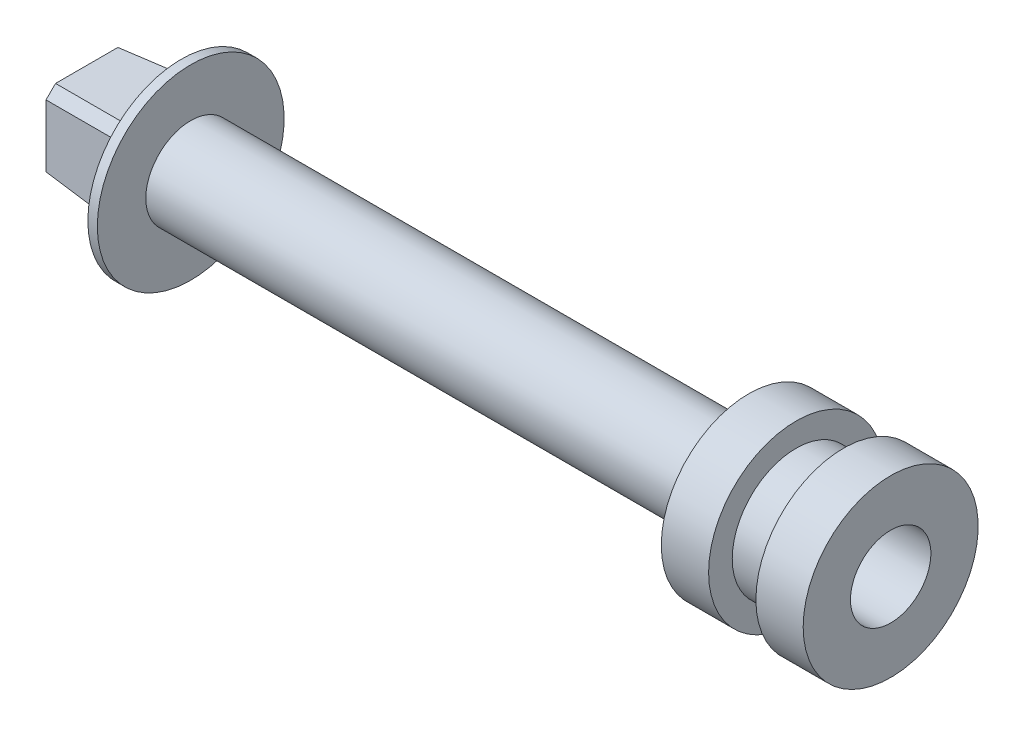
ISO-10303-21;
HEADER;
FILE_DESCRIPTION(('STEP AP214'),'2;1');
FILE_NAME('part.step','',(''),(''),'','','');
FILE_SCHEMA(('AUTOMOTIVE_DESIGN { 1 0 10303 214 1 1 1 1 }'));
ENDSEC;
DATA;
#1=APPLICATION_CONTEXT('core data for automotive mechanical design processes');
#2=APPLICATION_PROTOCOL_DEFINITION('international standard','automotive_design',2000,#1);
#3=PRODUCT_CONTEXT('',#1,'mechanical');
#4=PRODUCT('Part','Part','',(#3));
#5=PRODUCT_RELATED_PRODUCT_CATEGORY('part','',(#4));
#6=PRODUCT_DEFINITION_FORMATION('','',#4);
#7=PRODUCT_DEFINITION_CONTEXT('part definition',#1,'design');
#8=PRODUCT_DEFINITION('design','',#6,#7);
#9=PRODUCT_DEFINITION_SHAPE('','',#8);
#10=(LENGTH_UNIT() NAMED_UNIT(*) SI_UNIT(.MILLI.,.METRE.));
#11=(NAMED_UNIT(*) PLANE_ANGLE_UNIT() SI_UNIT($,.RADIAN.));
#12=(NAMED_UNIT(*) SI_UNIT($,.STERADIAN.) SOLID_ANGLE_UNIT());
#13=UNCERTAINTY_MEASURE_WITH_UNIT(LENGTH_MEASURE(1.E-05),#10,'distance_accuracy_value','');
#14=(GEOMETRIC_REPRESENTATION_CONTEXT(3) GLOBAL_UNCERTAINTY_ASSIGNED_CONTEXT((#13)) GLOBAL_UNIT_ASSIGNED_CONTEXT((#10,
#11,#12)) REPRESENTATION_CONTEXT('',''));
#15=CARTESIAN_POINT('',(0.,0.,0.));
#16=DIRECTION('',(0.,0.,1.));
#17=DIRECTION('',(1.,0.,0.));
#18=AXIS2_PLACEMENT_3D('',#15,#16,#17);
#19=CARTESIAN_POINT('',(0.,0.,0.));
#20=DIRECTION('',(1.,0.,0.));
#21=DIRECTION('',(0.,0.,-1.));
#22=AXIS2_PLACEMENT_3D('',#19,#20,#21);
#23=PLANE('',#22);
#24=CARTESIAN_POINT('',(0.,0.,0.));
#25=DIRECTION('',(-1.,0.,0.));
#26=DIRECTION('',(0.,0.,1.));
#27=AXIS2_PLACEMENT_3D('',#24,#25,#26);
#28=CIRCLE('',#27,39.5);
#29=CARTESIAN_POINT('',(0.,0.,39.5));
#30=VERTEX_POINT('',#29);
#31=EDGE_CURVE('E181',#30,#30,#28,.T.);
#32=ORIENTED_EDGE('',*,*,#31,.T.);
#33=EDGE_LOOP('',(#32));
#34=FACE_BOUND('',#33,.T.);
#35=DIRECTION('',(0.,-1.,0.));
#36=VECTOR('',#35,1.);
#37=CARTESIAN_POINT('',(0.,20.,-20.));
#38=LINE('',#37,#36);
#39=CARTESIAN_POINT('',(0.,15.9706253771279,-20.));
#40=VERTEX_POINT('',#39);
#41=CARTESIAN_POINT('',(0.,-15.9902798788361,-20.));
#42=VERTEX_POINT('',#41);
#43=EDGE_CURVE('E130',#40,#42,#38,.T.);
#44=ORIENTED_EDGE('',*,*,#43,.F.);
#45=DIRECTION('',(0.,-0.708833443361784,-0.705375892394882));
#46=VECTOR('',#45,1.);
#47=CARTESIAN_POINT('',(0.,17.9461473516864,-18.0341142354387));
#48=LINE('',#47,#46);
#49=CARTESIAN_POINT('',(0.,20.,-15.990279878836));
#50=VERTEX_POINT('',#49);
#51=EDGE_CURVE('E50',#40,#50,#48,.F.);
#52=ORIENTED_EDGE('',*,*,#51,.T.);
#53=DIRECTION('',(0.,0.,-1.));
#54=VECTOR('',#53,1.);
#55=CARTESIAN_POINT('',(0.,20.,-20.));
#56=LINE('',#55,#54);
#57=CARTESIAN_POINT('',(0.,20.,15.9706253771279));
#58=VERTEX_POINT('',#57);
#59=EDGE_CURVE('E133',#58,#50,#56,.T.);
#60=ORIENTED_EDGE('',*,*,#59,.F.);
#61=DIRECTION('',(0.,0.705375892394887,-0.708833443361779));
#62=VECTOR('',#61,1.);
#63=CARTESIAN_POINT('',(0.,18.0341142354385,17.9461473516865));
#64=LINE('',#63,#62);
#65=CARTESIAN_POINT('',(0.,15.9902798788359,20.));
#66=VERTEX_POINT('',#65);
#67=EDGE_CURVE('E11',#58,#66,#64,.F.);
#68=ORIENTED_EDGE('',*,*,#67,.T.);
#69=DIRECTION('',(0.,1.,0.));
#70=VECTOR('',#69,1.);
#71=CARTESIAN_POINT('',(0.,20.,20.));
#72=LINE('',#71,#70);
#73=CARTESIAN_POINT('',(0.,-15.9706253771279,20.));
#74=VERTEX_POINT('',#73);
#75=EDGE_CURVE('E129',#74,#66,#72,.T.);
#76=ORIENTED_EDGE('',*,*,#75,.F.);
#77=DIRECTION('',(0.,0.708833443361779,0.705375892394887));
#78=VECTOR('',#77,1.);
#79=CARTESIAN_POINT('',(0.,-17.9461473516865,18.0341142354386));
#80=LINE('',#79,#78);
#81=CARTESIAN_POINT('',(0.,-20.,15.990279878836));
#82=VERTEX_POINT('',#81);
#83=EDGE_CURVE('E114',#74,#82,#80,.F.);
#84=ORIENTED_EDGE('',*,*,#83,.T.);
#85=DIRECTION('',(0.,0.,1.));
#86=VECTOR('',#85,1.);
#87=CARTESIAN_POINT('',(0.,-20.,-20.));
#88=LINE('',#87,#86);
#89=CARTESIAN_POINT('',(0.,-20.,-15.970625377128));
#90=VERTEX_POINT('',#89);
#91=EDGE_CURVE('E121',#90,#82,#88,.T.);
#92=ORIENTED_EDGE('',*,*,#91,.F.);
#93=DIRECTION('',(0.,-0.705375892394882,0.708833443361784));
#94=VECTOR('',#93,1.);
#95=CARTESIAN_POINT('',(0.,-18.0341142354388,-17.9461473516864));
#96=LINE('',#95,#94);
#97=EDGE_CURVE('E106',#90,#42,#96,.F.);
#98=ORIENTED_EDGE('',*,*,#97,.T.);
#99=EDGE_LOOP('',(#44,#52,#60,#68,#76,#84,#92,#98));
#100=FACE_BOUND('',#99,.T.);
#101=ADVANCED_FACE('F41',(#34,#100),#23,.F.);
#102=CARTESIAN_POINT('',(0.,0.,0.));
#103=DIRECTION('',(-1.,0.,0.));
#104=DIRECTION('',(0.,0.,1.));
#105=AXIS2_PLACEMENT_3D('',#102,#103,#104);
#106=CYLINDRICAL_SURFACE('',#105,39.5);
#107=ORIENTED_EDGE('',*,*,#31,.F.);
#108=EDGE_LOOP('',(#107));
#109=FACE_BOUND('',#108,.T.);
#110=CARTESIAN_POINT('',(4.,0.,0.));
#111=DIRECTION('',(-1.,0.,0.));
#112=DIRECTION('',(0.,0.,1.));
#113=AXIS2_PLACEMENT_3D('',#110,#111,#112);
#114=CIRCLE('',#113,39.5);
#115=CARTESIAN_POINT('',(4.,0.,39.5));
#116=VERTEX_POINT('',#115);
#117=EDGE_CURVE('E178',#116,#116,#114,.T.);
#118=ORIENTED_EDGE('',*,*,#117,.T.);
#119=EDGE_LOOP('',(#118));
#120=FACE_BOUND('',#119,.T.);
#121=ADVANCED_FACE('F230',(#109,#120),#106,.T.);
#122=CARTESIAN_POINT('',(4.,39.5,0.));
#123=DIRECTION('',(-1.,0.,0.));
#124=DIRECTION('',(0.,0.,1.));
#125=AXIS2_PLACEMENT_3D('',#122,#123,#124);
#126=PLANE('',#125);
#127=ORIENTED_EDGE('',*,*,#117,.F.);
#128=EDGE_LOOP('',(#127));
#129=FACE_BOUND('',#128,.T.);
#130=CARTESIAN_POINT('',(4.,0.,0.));
#131=DIRECTION('',(-1.,0.,0.));
#132=DIRECTION('',(0.,0.,1.));
#133=AXIS2_PLACEMENT_3D('',#130,#131,#132);
#134=CIRCLE('',#133,19.);
#135=CARTESIAN_POINT('',(4.,0.,19.));
#136=VERTEX_POINT('',#135);
#137=EDGE_CURVE('E175',#136,#136,#134,.T.);
#138=ORIENTED_EDGE('',*,*,#137,.T.);
#139=EDGE_LOOP('',(#138));
#140=FACE_BOUND('',#139,.T.);
#141=ADVANCED_FACE('F236',(#129,#140),#126,.F.);
#142=CARTESIAN_POINT('',(0.,0.,0.));
#143=DIRECTION('',(-1.,0.,0.));
#144=DIRECTION('',(0.,0.,1.));
#145=AXIS2_PLACEMENT_3D('',#142,#143,#144);
#146=CYLINDRICAL_SURFACE('',#145,19.);
#147=ORIENTED_EDGE('',*,*,#137,.F.);
#148=EDGE_LOOP('',(#147));
#149=FACE_BOUND('',#148,.T.);
#150=CARTESIAN_POINT('',(240.,0.,0.));
#151=DIRECTION('',(-1.,0.,0.));
#152=DIRECTION('',(0.,0.,1.));
#153=AXIS2_PLACEMENT_3D('',#150,#151,#152);
#154=CIRCLE('',#153,19.);
#155=CARTESIAN_POINT('',(240.,0.,19.));
#156=VERTEX_POINT('',#155);
#157=EDGE_CURVE('E172',#156,#156,#154,.T.);
#158=ORIENTED_EDGE('',*,*,#157,.T.);
#159=EDGE_LOOP('',(#158));
#160=FACE_BOUND('',#159,.T.);
#161=ADVANCED_FACE('F416',(#149,#160),#146,.T.);
#162=CARTESIAN_POINT('',(240.,19.,0.));
#163=DIRECTION('',(1.,0.,0.));
#164=DIRECTION('',(0.,0.,-1.));
#165=AXIS2_PLACEMENT_3D('',#162,#163,#164);
#166=PLANE('',#165);
#167=ORIENTED_EDGE('',*,*,#157,.F.);
#168=EDGE_LOOP('',(#167));
#169=FACE_BOUND('',#168,.T.);
#170=CARTESIAN_POINT('',(240.,0.,0.));
#171=DIRECTION('',(-1.,0.,0.));
#172=DIRECTION('',(0.,0.,1.));
#173=AXIS2_PLACEMENT_3D('',#170,#171,#172);
#174=CIRCLE('',#173,37.);
#175=CARTESIAN_POINT('',(240.,0.,37.));
#176=VERTEX_POINT('',#175);
#177=EDGE_CURVE('E169',#176,#176,#174,.T.);
#178=ORIENTED_EDGE('',*,*,#177,.T.);
#179=EDGE_LOOP('',(#178));
#180=FACE_BOUND('',#179,.T.);
#181=ADVANCED_FACE('F406',(#169,#180),#166,.F.);
#182=CARTESIAN_POINT('',(0.,0.,0.));
#183=DIRECTION('',(-1.,0.,0.));
#184=DIRECTION('',(0.,0.,1.));
#185=AXIS2_PLACEMENT_3D('',#182,#183,#184);
#186=CYLINDRICAL_SURFACE('',#185,37.);
#187=ORIENTED_EDGE('',*,*,#177,.F.);
#188=EDGE_LOOP('',(#187));
#189=FACE_BOUND('',#188,.T.);
#190=CARTESIAN_POINT('',(260.,0.,0.));
#191=DIRECTION('',(-1.,0.,0.));
#192=DIRECTION('',(0.,0.,1.));
#193=AXIS2_PLACEMENT_3D('',#190,#191,#192);
#194=CIRCLE('',#193,37.);
#195=CARTESIAN_POINT('',(260.,0.,37.));
#196=VERTEX_POINT('',#195);
#197=EDGE_CURVE('E166',#196,#196,#194,.T.);
#198=ORIENTED_EDGE('',*,*,#197,.T.);
#199=EDGE_LOOP('',(#198));
#200=FACE_BOUND('',#199,.T.);
#201=ADVANCED_FACE('F396',(#189,#200),#186,.T.);
#202=CARTESIAN_POINT('',(260.,37.,0.));
#203=DIRECTION('',(-1.,0.,0.));
#204=DIRECTION('',(0.,0.,1.));
#205=AXIS2_PLACEMENT_3D('',#202,#203,#204);
#206=PLANE('',#205);
#207=ORIENTED_EDGE('',*,*,#197,.F.);
#208=EDGE_LOOP('',(#207));
#209=FACE_BOUND('',#208,.T.);
#210=CARTESIAN_POINT('',(260.,0.,0.));
#211=DIRECTION('',(-1.,0.,0.));
#212=DIRECTION('',(0.,0.,1.));
#213=AXIS2_PLACEMENT_3D('',#210,#211,#212);
#214=CIRCLE('',#213,27.);
#215=CARTESIAN_POINT('',(260.,0.,27.));
#216=VERTEX_POINT('',#215);
#217=EDGE_CURVE('E163',#216,#216,#214,.T.);
#218=ORIENTED_EDGE('',*,*,#217,.T.);
#219=EDGE_LOOP('',(#218));
#220=FACE_BOUND('',#219,.T.);
#221=ADVANCED_FACE('F386',(#209,#220),#206,.F.);
#222=CARTESIAN_POINT('',(0.,0.,0.));
#223=DIRECTION('',(-1.,0.,0.));
#224=DIRECTION('',(0.,0.,1.));
#225=AXIS2_PLACEMENT_3D('',#222,#223,#224);
#226=CYLINDRICAL_SURFACE('',#225,27.);
#227=ORIENTED_EDGE('',*,*,#217,.F.);
#228=EDGE_LOOP('',(#227));
#229=FACE_BOUND('',#228,.T.);
#230=CARTESIAN_POINT('',(280.,0.,0.));
#231=DIRECTION('',(-1.,0.,0.));
#232=DIRECTION('',(0.,0.,1.));
#233=AXIS2_PLACEMENT_3D('',#230,#231,#232);
#234=CIRCLE('',#233,27.);
#235=CARTESIAN_POINT('',(280.,0.,27.));
#236=VERTEX_POINT('',#235);
#237=EDGE_CURVE('E160',#236,#236,#234,.T.);
#238=ORIENTED_EDGE('',*,*,#237,.T.);
#239=EDGE_LOOP('',(#238));
#240=FACE_BOUND('',#239,.T.);
#241=ADVANCED_FACE('F376',(#229,#240),#226,.T.);
#242=CARTESIAN_POINT('',(280.,27.,0.));
#243=DIRECTION('',(1.,0.,0.));
#244=DIRECTION('',(0.,0.,-1.));
#245=AXIS2_PLACEMENT_3D('',#242,#243,#244);
#246=PLANE('',#245);
#247=ORIENTED_EDGE('',*,*,#237,.F.);
#248=EDGE_LOOP('',(#247));
#249=FACE_BOUND('',#248,.T.);
#250=CARTESIAN_POINT('',(280.,0.,0.));
#251=DIRECTION('',(-1.,0.,0.));
#252=DIRECTION('',(0.,0.,1.));
#253=AXIS2_PLACEMENT_3D('',#250,#251,#252);
#254=CIRCLE('',#253,37.);
#255=CARTESIAN_POINT('',(280.,0.,37.));
#256=VERTEX_POINT('',#255);
#257=EDGE_CURVE('E157',#256,#256,#254,.T.);
#258=ORIENTED_EDGE('',*,*,#257,.T.);
#259=EDGE_LOOP('',(#258));
#260=FACE_BOUND('',#259,.T.);
#261=ADVANCED_FACE('F366',(#249,#260),#246,.F.);
#262=CARTESIAN_POINT('',(0.,0.,0.));
#263=DIRECTION('',(-1.,0.,0.));
#264=DIRECTION('',(0.,0.,1.));
#265=AXIS2_PLACEMENT_3D('',#262,#263,#264);
#266=CYLINDRICAL_SURFACE('',#265,37.);
#267=ORIENTED_EDGE('',*,*,#257,.F.);
#268=EDGE_LOOP('',(#267));
#269=FACE_BOUND('',#268,.T.);
#270=CARTESIAN_POINT('',(300.,0.,0.));
#271=DIRECTION('',(-1.,0.,0.));
#272=DIRECTION('',(0.,0.,1.));
#273=AXIS2_PLACEMENT_3D('',#270,#271,#272);
#274=CIRCLE('',#273,37.);
#275=CARTESIAN_POINT('',(300.,0.,37.));
#276=VERTEX_POINT('',#275);
#277=EDGE_CURVE('E154',#276,#276,#274,.T.);
#278=ORIENTED_EDGE('',*,*,#277,.T.);
#279=EDGE_LOOP('',(#278));
#280=FACE_BOUND('',#279,.T.);
#281=ADVANCED_FACE('F356',(#269,#280),#266,.T.);
#282=CARTESIAN_POINT('',(300.,37.,0.));
#283=DIRECTION('',(-1.,0.,0.));
#284=DIRECTION('',(0.,0.,1.));
#285=AXIS2_PLACEMENT_3D('',#282,#283,#284);
#286=PLANE('',#285);
#287=ORIENTED_EDGE('',*,*,#277,.F.);
#288=EDGE_LOOP('',(#287));
#289=FACE_BOUND('',#288,.T.);
#290=CARTESIAN_POINT('',(300.,0.,0.));
#291=DIRECTION('',(-1.,0.,0.));
#292=DIRECTION('',(0.,0.,1.));
#293=AXIS2_PLACEMENT_3D('',#290,#291,#292);
#294=CIRCLE('',#293,17.);
#295=CARTESIAN_POINT('',(300.,0.,17.));
#296=VERTEX_POINT('',#295);
#297=EDGE_CURVE('E151',#296,#296,#294,.T.);
#298=ORIENTED_EDGE('',*,*,#297,.T.);
#299=EDGE_LOOP('',(#298));
#300=FACE_BOUND('',#299,.T.);
#301=ADVANCED_FACE('F346',(#289,#300),#286,.F.);
#302=CARTESIAN_POINT('',(0.,0.,0.));
#303=DIRECTION('',(-1.,0.,0.));
#304=DIRECTION('',(0.,0.,1.));
#305=AXIS2_PLACEMENT_3D('',#302,#303,#304);
#306=CYLINDRICAL_SURFACE('',#305,17.);
#307=ORIENTED_EDGE('',*,*,#297,.F.);
#308=EDGE_LOOP('',(#307));
#309=FACE_BOUND('',#308,.T.);
#310=CARTESIAN_POINT('',(270.,0.,0.));
#311=DIRECTION('',(-1.,0.,0.));
#312=DIRECTION('',(0.,0.,1.));
#313=AXIS2_PLACEMENT_3D('',#310,#311,#312);
#314=CIRCLE('',#313,17.0000000000001);
#315=CARTESIAN_POINT('',(270.,0.,17.0000000000001));
#316=VERTEX_POINT('',#315);
#317=EDGE_CURVE('E148',#316,#316,#314,.T.);
#318=ORIENTED_EDGE('',*,*,#317,.T.);
#319=EDGE_LOOP('',(#318));
#320=FACE_BOUND('',#319,.T.);
#321=ADVANCED_FACE('F337',(#309,#320),#306,.F.);
#322=CARTESIAN_POINT('',(270.,17.0000000000001,0.));
#323=DIRECTION('',(-1.,0.,0.));
#324=DIRECTION('',(0.,0.,1.));
#325=AXIS2_PLACEMENT_3D('',#322,#323,#324);
#326=PLANE('',#325);
#327=ORIENTED_EDGE('',*,*,#317,.F.);
#328=EDGE_LOOP('',(#327));
#329=FACE_BOUND('',#328,.T.);
#330=ADVANCED_FACE('F321',(#329),#326,.F.);
#331=CARTESIAN_POINT('',(0.,20.,-20.));
#332=DIRECTION('',(-0.0697564737441253,0.,-0.997564050259824));
#333=DIRECTION('',(-0.997564050259824,0.,0.0697564737441253));
#334=AXIS2_PLACEMENT_3D('',#331,#332,#333);
#335=PLANE('',#334);
#336=ORIENTED_EDGE('',*,*,#43,.T.);
#337=DIRECTION('',(0.995145815783509,-0.0695873743166647,-0.0695873743166647));
#338=VECTOR('',#337,1.);
#339=CARTESIAN_POINT('',(-2.49231192342248,-15.8160004516624,-19.8257205728263));
#340=LINE('',#339,#338);
#341=CARTESIAN_POINT('',(-40.,-13.1932074010957,-17.2029275222596));
#342=VERTEX_POINT('',#341);
#343=EDGE_CURVE('E111',#42,#342,#340,.F.);
#344=ORIENTED_EDGE('',*,*,#343,.T.);
#345=DIRECTION('',(0.,1.,0.));
#346=VECTOR('',#345,1.);
#347=CARTESIAN_POINT('',(-40.,20.,-17.2029275222596));
#348=LINE('',#347,#346);
#349=CARTESIAN_POINT('',(-40.,13.1735528993875,-17.2029275222596));
#350=VERTEX_POINT('',#349);
#351=EDGE_CURVE('E138',#350,#342,#348,.F.);
#352=ORIENTED_EDGE('',*,*,#351,.F.);
#353=DIRECTION('',(-0.995145815783509,-0.0695873743166647,0.0695873743166647));
#354=VECTOR('',#353,1.);
#355=CARTESIAN_POINT('',(0.279032517955649,15.9901372315371,-20.0195118544092));
#356=LINE('',#355,#354);
#357=EDGE_CURVE('E125',#350,#40,#356,.F.);
#358=ORIENTED_EDGE('',*,*,#357,.T.);
#359=EDGE_LOOP('',(#336,#344,#352,#358));
#360=FACE_BOUND('',#359,.T.);
#361=ADVANCED_FACE('F217',(#360),#335,.T.);
#362=CARTESIAN_POINT('',(0.,-20.,-20.));
#363=DIRECTION('',(-0.0697564737441253,-0.997564050259824,0.));
#364=DIRECTION('',(0.997564050259824,-0.0697564737441253,0.));
#365=AXIS2_PLACEMENT_3D('',#362,#363,#364);
#366=PLANE('',#365);
#367=DIRECTION('',(0.,0.,-1.));
#368=VECTOR('',#367,1.);
#369=CARTESIAN_POINT('',(-40.,-17.2029275222596,-20.));
#370=LINE('',#369,#368);
#371=CARTESIAN_POINT('',(-40.,-17.2029275222596,-13.1735528993876));
#372=VERTEX_POINT('',#371);
#373=CARTESIAN_POINT('',(-40.,-17.2029275222596,13.1932074010956));
#374=VERTEX_POINT('',#373);
#375=EDGE_CURVE('E124',#372,#374,#370,.F.);
#376=ORIENTED_EDGE('',*,*,#375,.F.);
#377=DIRECTION('',(-0.995145815783509,0.0695873743166647,0.0695873743166647));
#378=VECTOR('',#377,1.);
#379=CARTESIAN_POINT('',(0.279032517955641,-20.0195118544092,-15.9901372315372));
#380=LINE('',#379,#378);
#381=EDGE_CURVE('E110',#372,#90,#380,.F.);
#382=ORIENTED_EDGE('',*,*,#381,.T.);
#383=ORIENTED_EDGE('',*,*,#91,.T.);
#384=DIRECTION('',(0.995145815783509,-0.0695873743166647,0.0695873743166647));
#385=VECTOR('',#384,1.);
#386=CARTESIAN_POINT('',(-2.49231192342247,-19.8257205728263,15.8160004516623));
#387=LINE('',#386,#385);
#388=EDGE_CURVE('E126',#82,#374,#387,.F.);
#389=ORIENTED_EDGE('',*,*,#388,.T.);
#390=EDGE_LOOP('',(#376,#382,#383,#389));
#391=FACE_BOUND('',#390,.T.);
#392=ADVANCED_FACE('F120',(#391),#366,.T.);
#393=CARTESIAN_POINT('',(0.,20.,20.));
#394=DIRECTION('',(-0.0697564737441253,0.,0.997564050259824));
#395=DIRECTION('',(0.997564050259824,0.,0.0697564737441253));
#396=AXIS2_PLACEMENT_3D('',#393,#394,#395);
#397=PLANE('',#396);
#398=DIRECTION('',(0.,-1.,0.));
#399=VECTOR('',#398,1.);
#400=CARTESIAN_POINT('',(-40.,20.,17.2029275222596));
#401=LINE('',#400,#399);
#402=CARTESIAN_POINT('',(-40.,-13.1735528993875,17.2029275222596));
#403=VERTEX_POINT('',#402);
#404=CARTESIAN_POINT('',(-40.,13.1932074010955,17.2029275222596));
#405=VERTEX_POINT('',#404);
#406=EDGE_CURVE('E142',#403,#405,#401,.F.);
#407=ORIENTED_EDGE('',*,*,#406,.F.);
#408=DIRECTION('',(-0.995145815783509,0.0695873743166647,-0.0695873743166647));
#409=VECTOR('',#408,1.);
#410=CARTESIAN_POINT('',(-2.49095085734794,-15.7964411249656,19.8258157478377));
#411=LINE('',#410,#409);
#412=EDGE_CURVE('E198',#403,#74,#411,.F.);
#413=ORIENTED_EDGE('',*,*,#412,.T.);
#414=ORIENTED_EDGE('',*,*,#75,.T.);
#415=DIRECTION('',(0.995145815783509,0.0695873743166647,0.0695873743166647));
#416=VECTOR('',#415,1.);
#417=CARTESIAN_POINT('',(0.277671451881119,16.0096965582337,20.0194166793978));
#418=LINE('',#417,#416);
#419=EDGE_CURVE('E196',#66,#405,#418,.F.);
#420=ORIENTED_EDGE('',*,*,#419,.T.);
#421=EDGE_LOOP('',(#407,#413,#414,#420));
#422=FACE_BOUND('',#421,.T.);
#423=ADVANCED_FACE('F224',(#422),#397,.T.);
#424=CARTESIAN_POINT('',(0.,20.,-20.));
#425=DIRECTION('',(-0.0697564737441253,0.997564050259824,0.));
#426=DIRECTION('',(-0.997564050259824,-0.0697564737441253,0.));
#427=AXIS2_PLACEMENT_3D('',#424,#425,#426);
#428=PLANE('',#427);
#429=ORIENTED_EDGE('',*,*,#59,.T.);
#430=DIRECTION('',(0.995145815783509,0.0695873743166647,-0.0695873743166647));
#431=VECTOR('',#430,1.);
#432=CARTESIAN_POINT('',(0.277671451881115,20.0194166793978,-16.0096965582338));
#433=LINE('',#432,#431);
#434=CARTESIAN_POINT('',(-40.,17.2029275222596,-13.1932074010956));
#435=VERTEX_POINT('',#434);
#436=EDGE_CURVE('E115',#50,#435,#433,.F.);
#437=ORIENTED_EDGE('',*,*,#436,.T.);
#438=DIRECTION('',(0.,0.,1.));
#439=VECTOR('',#438,1.);
#440=CARTESIAN_POINT('',(-40.,17.2029275222596,-20.));
#441=LINE('',#440,#439);
#442=CARTESIAN_POINT('',(-40.,17.2029275222596,13.1735528993875));
#443=VERTEX_POINT('',#442);
#444=EDGE_CURVE('E145',#443,#435,#441,.F.);
#445=ORIENTED_EDGE('',*,*,#444,.F.);
#446=DIRECTION('',(-0.995145815783509,-0.0695873743166647,-0.0695873743166647));
#447=VECTOR('',#446,1.);
#448=CARTESIAN_POINT('',(-2.49095085734794,19.8258157478377,15.7964411249656));
#449=LINE('',#448,#447);
#450=EDGE_CURVE('E201',#443,#58,#449,.F.);
#451=ORIENTED_EDGE('',*,*,#450,.T.);
#452=EDGE_LOOP('',(#429,#437,#445,#451));
#453=FACE_BOUND('',#452,.T.);
#454=ADVANCED_FACE('F207',(#453),#428,.T.);
#455=CARTESIAN_POINT('',(-40.,0.,0.));
#456=DIRECTION('',(-1.,0.,0.));
#457=DIRECTION('',(0.,-1.,0.));
#458=AXIS2_PLACEMENT_3D('',#455,#456,#457);
#459=PLANE('',#458);
#460=ORIENTED_EDGE('',*,*,#351,.T.);
#461=DIRECTION('',(0.,0.705375892394882,-0.708833443361784));
#462=VECTOR('',#461,1.);
#463=CARTESIAN_POINT('',(-40.,-15.230220052877,-15.1559300168141));
#464=LINE('',#463,#462);
#465=EDGE_CURVE('E194',#342,#372,#464,.F.);
#466=ORIENTED_EDGE('',*,*,#465,.T.);
#467=ORIENTED_EDGE('',*,*,#375,.T.);
#468=DIRECTION('',(0.,-0.708833443361779,-0.705375892394887));
#469=VECTOR('',#468,1.);
#470=CARTESIAN_POINT('',(-40.,-15.1559300168142,15.2302200528769));
#471=LINE('',#470,#469);
#472=EDGE_CURVE('E192',#374,#403,#471,.F.);
#473=ORIENTED_EDGE('',*,*,#472,.T.);
#474=ORIENTED_EDGE('',*,*,#406,.T.);
#475=DIRECTION('',(0.,-0.705375892394887,0.708833443361779));
#476=VECTOR('',#475,1.);
#477=CARTESIAN_POINT('',(-40.,15.2302200528769,15.1559300168142));
#478=LINE('',#477,#476);
#479=EDGE_CURVE('E188',#405,#443,#478,.F.);
#480=ORIENTED_EDGE('',*,*,#479,.T.);
#481=ORIENTED_EDGE('',*,*,#444,.T.);
#482=DIRECTION('',(0.,0.708833443361784,0.705375892394882));
#483=VECTOR('',#482,1.);
#484=CARTESIAN_POINT('',(-40.,15.1559300168141,-15.230220052877));
#485=LINE('',#484,#483);
#486=EDGE_CURVE('E190',#435,#350,#485,.F.);
#487=ORIENTED_EDGE('',*,*,#486,.T.);
#488=EDGE_LOOP('',(#460,#466,#467,#473,#474,#480,#481,#487));
#489=FACE_BOUND('',#488,.T.);
#490=ADVANCED_FACE('F211',(#489),#459,.T.);
#491=CARTESIAN_POINT('',(0.279032517955641,-20.0195118544092,-15.9901372315372));
#492=DIRECTION('',(0.0984111172578949,0.70539265566623,0.701951888189067));
#493=DIRECTION('',(0.995145815783508,-0.0695873743166647,-0.0695873743166647));
#494=AXIS2_PLACEMENT_3D('',#491,#492,#493);
#495=PLANE('',#494);
#496=ORIENTED_EDGE('',*,*,#465,.F.);
#497=ORIENTED_EDGE('',*,*,#343,.F.);
#498=ORIENTED_EDGE('',*,*,#97,.F.);
#499=ORIENTED_EDGE('',*,*,#381,.F.);
#500=EDGE_LOOP('',(#496,#497,#498,#499));
#501=FACE_BOUND('',#500,.T.);
#502=ADVANCED_FACE('F109',(#501),#495,.F.);
#503=CARTESIAN_POINT('',(-2.49095085734794,-15.7964411249656,19.8258157478377));
#504=DIRECTION('',(0.0984111172578949,0.701951888189072,-0.705392655666225));
#505=DIRECTION('',(0.995145815783508,-0.0695873743166647,0.0695873743166647));
#506=AXIS2_PLACEMENT_3D('',#503,#504,#505);
#507=PLANE('',#506);
#508=ORIENTED_EDGE('',*,*,#472,.F.);
#509=ORIENTED_EDGE('',*,*,#388,.F.);
#510=ORIENTED_EDGE('',*,*,#83,.F.);
#511=ORIENTED_EDGE('',*,*,#412,.F.);
#512=EDGE_LOOP('',(#508,#509,#510,#511));
#513=FACE_BOUND('',#512,.T.);
#514=ADVANCED_FACE('F222',(#513),#507,.F.);
#515=CARTESIAN_POINT('',(0.279032517955649,15.9901372315371,-20.0195118544092));
#516=DIRECTION('',(0.0984111172578949,-0.701951888189067,0.70539265566623));
#517=DIRECTION('',(0.995145815783508,0.0695873743166647,-0.0695873743166647));
#518=AXIS2_PLACEMENT_3D('',#515,#516,#517);
#519=PLANE('',#518);
#520=ORIENTED_EDGE('',*,*,#486,.F.);
#521=ORIENTED_EDGE('',*,*,#436,.F.);
#522=ORIENTED_EDGE('',*,*,#51,.F.);
#523=ORIENTED_EDGE('',*,*,#357,.F.);
#524=EDGE_LOOP('',(#520,#521,#522,#523));
#525=FACE_BOUND('',#524,.T.);
#526=ADVANCED_FACE('F215',(#525),#519,.F.);
#527=CARTESIAN_POINT('',(-2.49095085734794,19.8258157478377,15.7964411249656));
#528=DIRECTION('',(0.0984111172578948,-0.705392655666224,-0.701951888189072));
#529=DIRECTION('',(0.995145815783508,0.0695873743166647,0.0695873743166647));
#530=AXIS2_PLACEMENT_3D('',#527,#528,#529);
#531=PLANE('',#530);
#532=ORIENTED_EDGE('',*,*,#479,.F.);
#533=ORIENTED_EDGE('',*,*,#419,.F.);
#534=ORIENTED_EDGE('',*,*,#67,.F.);
#535=ORIENTED_EDGE('',*,*,#450,.F.);
#536=EDGE_LOOP('',(#532,#533,#534,#535));
#537=FACE_BOUND('',#536,.T.);
#538=ADVANCED_FACE('F44',(#537),#531,.F.);
#539=CLOSED_SHELL('',(#101,#121,#141,#161,#181,#201,#221,#241,#261,#281,#301,#321,#330,#361,
#392,#423,#454,#490,#502,#514,#526,#538));
#540=MANIFOLD_SOLID_BREP('B2',#539);
#541=ADVANCED_BREP_SHAPE_REPRESENTATION('',(#18,#540),#14);
#542=SHAPE_DEFINITION_REPRESENTATION(#9,#541);
ENDSEC;
END-ISO-10303-21;
